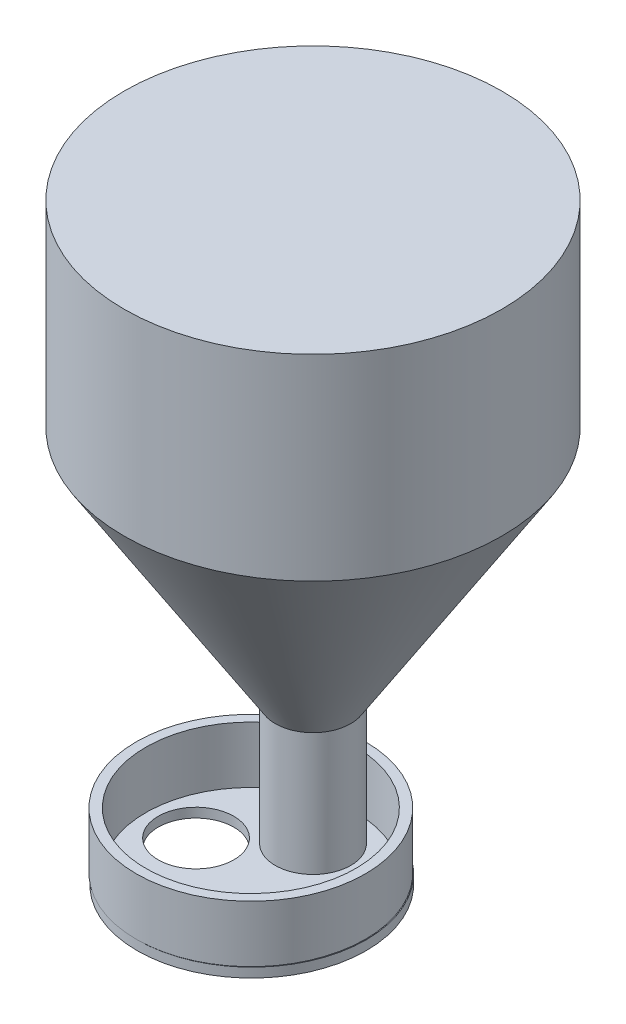
ISO-10303-21;
HEADER;
FILE_DESCRIPTION(('STEP AP214'),'2;1');
FILE_NAME('part.step','',(''),(''),'','','');
FILE_SCHEMA(('AUTOMOTIVE_DESIGN { 1 0 10303 214 1 1 1 1 }'));
ENDSEC;
DATA;
#1=APPLICATION_CONTEXT('core data for automotive mechanical design processes');
#2=APPLICATION_PROTOCOL_DEFINITION('international standard','automotive_design',2000,#1);
#3=PRODUCT_CONTEXT('',#1,'mechanical');
#4=PRODUCT('Part','Part','',(#3));
#5=PRODUCT_RELATED_PRODUCT_CATEGORY('part','',(#4));
#6=PRODUCT_DEFINITION_FORMATION('','',#4);
#7=PRODUCT_DEFINITION_CONTEXT('part definition',#1,'design');
#8=PRODUCT_DEFINITION('design','',#6,#7);
#9=PRODUCT_DEFINITION_SHAPE('','',#8);
#10=(LENGTH_UNIT() NAMED_UNIT(*) SI_UNIT(.MILLI.,.METRE.));
#11=(NAMED_UNIT(*) PLANE_ANGLE_UNIT() SI_UNIT($,.RADIAN.));
#12=(NAMED_UNIT(*) SI_UNIT($,.STERADIAN.) SOLID_ANGLE_UNIT());
#13=UNCERTAINTY_MEASURE_WITH_UNIT(LENGTH_MEASURE(1.E-05),#10,'distance_accuracy_value','');
#14=(GEOMETRIC_REPRESENTATION_CONTEXT(3) GLOBAL_UNCERTAINTY_ASSIGNED_CONTEXT((#13)) GLOBAL_UNIT_ASSIGNED_CONTEXT((#10,
#11,#12)) REPRESENTATION_CONTEXT('',''));
#15=CARTESIAN_POINT('',(0.,0.,0.));
#16=DIRECTION('',(0.,0.,1.));
#17=DIRECTION('',(1.,0.,0.));
#18=AXIS2_PLACEMENT_3D('',#15,#16,#17);
#19=CARTESIAN_POINT('',(-32.8934755645154,-325.,0.));
#20=DIRECTION('',(0.,-1.,0.));
#21=DIRECTION('',(0.,0.,-1.));
#22=AXIS2_PLACEMENT_3D('',#19,#20,#21);
#23=PLANE('',#22);
#24=CARTESIAN_POINT('',(-32.4436156280203,-325.,0.));
#25=DIRECTION('',(0.,-1.,0.));
#26=DIRECTION('',(0.,0.,-1.));
#27=AXIS2_PLACEMENT_3D('',#24,#25,#26);
#28=CIRCLE('',#27,60.6028261139354);
#29=CARTESIAN_POINT('',(-32.6685455962679,-325.,60.602408693923));
#30=VERTEX_POINT('',#29);
#31=CARTESIAN_POINT('',(-32.6685455962679,-325.,-60.602408693923));
#32=VERTEX_POINT('',#31);
#33=EDGE_CURVE('E60',#30,#32,#28,.T.);
#34=ORIENTED_EDGE('',*,*,#33,.F.);
#35=CARTESIAN_POINT('',(-32.8934755645154,-325.,0.));
#36=DIRECTION('',(0.,-1.,0.));
#37=DIRECTION('',(0.,0.,-1.));
#38=AXIS2_PLACEMENT_3D('',#35,#36,#37);
#39=CIRCLE('',#38,60.6028261139354);
#40=EDGE_CURVE('E54',#30,#32,#39,.T.);
#41=ORIENTED_EDGE('',*,*,#40,.T.);
#42=EDGE_LOOP('',(#34,#41));
#43=FACE_BOUND('',#42,.T.);
#44=ADVANCED_FACE('F45',(#43),#23,.T.);
#45=CARTESIAN_POINT('',(-32.8934755645154,-295.,0.));
#46=DIRECTION('',(0.,-1.,0.));
#47=DIRECTION('',(0.,0.,-1.));
#48=AXIS2_PLACEMENT_3D('',#45,#46,#47);
#49=PLANE('',#48);
#50=CARTESIAN_POINT('',(-32.8934755645154,-295.,0.));
#51=DIRECTION('',(0.,-1.,0.));
#52=DIRECTION('',(0.,0.,-1.));
#53=AXIS2_PLACEMENT_3D('',#50,#51,#52);
#54=CIRCLE('',#53,60.6028261139354);
#55=CARTESIAN_POINT('',(-32.8934755645154,-295.,-60.6028261139354));
#56=VERTEX_POINT('',#55);
#57=EDGE_CURVE('E49',#56,#56,#54,.T.);
#58=ORIENTED_EDGE('',*,*,#57,.F.);
#59=EDGE_LOOP('',(#58));
#60=FACE_BOUND('',#59,.T.);
#61=CARTESIAN_POINT('',(-32.8934755645154,-295.,0.));
#62=DIRECTION('',(0.,-1.,0.));
#63=DIRECTION('',(0.,0.,-1.));
#64=AXIS2_PLACEMENT_3D('',#61,#62,#63);
#65=CIRCLE('',#64,55.6028261139354);
#66=CARTESIAN_POINT('',(-32.8934755645154,-295.,-55.6028261139354));
#67=VERTEX_POINT('',#66);
#68=EDGE_CURVE('E82',#67,#67,#65,.T.);
#69=ORIENTED_EDGE('',*,*,#68,.T.);
#70=EDGE_LOOP('',(#69));
#71=FACE_BOUND('',#70,.T.);
#72=ADVANCED_FACE('F89',(#60,#71),#49,.F.);
#73=CARTESIAN_POINT('',(-32.8934755645154,-325.,0.));
#74=DIRECTION('',(0.,1.,0.));
#75=DIRECTION('',(0.,0.,1.));
#76=AXIS2_PLACEMENT_3D('',#73,#74,#75);
#77=CYLINDRICAL_SURFACE('',#76,60.6028261139354);
#78=EDGE_CURVE('E13',#32,#30,#39,.T.);
#79=ORIENTED_EDGE('',*,*,#78,.F.);
#80=ORIENTED_EDGE('',*,*,#40,.F.);
#81=EDGE_LOOP('',(#79,#80));
#82=FACE_BOUND('',#81,.T.);
#83=ORIENTED_EDGE('',*,*,#57,.T.);
#84=EDGE_LOOP('',(#83));
#85=FACE_BOUND('',#84,.T.);
#86=ADVANCED_FACE('F47',(#82,#85),#77,.T.);
#87=CARTESIAN_POINT('',(-32.8934755645154,-325.,0.));
#88=DIRECTION('',(0.,1.,0.));
#89=DIRECTION('',(0.,0.,1.));
#90=AXIS2_PLACEMENT_3D('',#87,#88,#89);
#91=CYLINDRICAL_SURFACE('',#90,55.6028261139354);
#92=CARTESIAN_POINT('',(-32.8934755645154,-325.,0.));
#93=DIRECTION('',(0.,-1.,0.));
#94=DIRECTION('',(0.,0.,-1.));
#95=AXIS2_PLACEMENT_3D('',#92,#93,#94);
#96=CIRCLE('',#95,55.6028261139354);
#97=CARTESIAN_POINT('',(-32.8934755645154,-325.,-55.6028261139354));
#98=VERTEX_POINT('',#97);
#99=EDGE_CURVE('E76',#98,#98,#96,.T.);
#100=ORIENTED_EDGE('',*,*,#99,.T.);
#101=EDGE_LOOP('',(#100));
#102=FACE_BOUND('',#101,.T.);
#103=ORIENTED_EDGE('',*,*,#68,.F.);
#104=EDGE_LOOP('',(#103));
#105=FACE_BOUND('',#104,.T.);
#106=ADVANCED_FACE('F95',(#102,#105),#91,.F.);
#107=CARTESIAN_POINT('',(-32.4436156280203,-325.,0.));
#108=DIRECTION('',(0.,-1.,0.));
#109=DIRECTION('',(0.,0.,-1.));
#110=AXIS2_PLACEMENT_3D('',#107,#108,#109);
#111=PLANE('',#110);
#112=EDGE_CURVE('E68',#32,#30,#28,.T.);
#113=ORIENTED_EDGE('',*,*,#112,.F.);
#114=ORIENTED_EDGE('',*,*,#78,.T.);
#115=EDGE_LOOP('',(#113,#114));
#116=FACE_BOUND('',#115,.T.);
#117=ADVANCED_FACE('F69',(#116),#111,.F.);
#118=CARTESIAN_POINT('',(-32.4436156280203,-330.,0.));
#119=DIRECTION('',(0.,-1.,0.));
#120=DIRECTION('',(0.,0.,-1.));
#121=AXIS2_PLACEMENT_3D('',#118,#119,#120);
#122=PLANE('',#121);
#123=CARTESIAN_POINT('',(-32.4436156280203,-330.,0.));
#124=DIRECTION('',(0.,-1.,0.));
#125=DIRECTION('',(0.,0.,-1.));
#126=AXIS2_PLACEMENT_3D('',#123,#124,#125);
#127=CIRCLE('',#126,60.6028261139354);
#128=CARTESIAN_POINT('',(-32.4436156280203,-330.,-60.6028261139354));
#129=VERTEX_POINT('',#128);
#130=EDGE_CURVE('E74',#129,#129,#127,.T.);
#131=ORIENTED_EDGE('',*,*,#130,.T.);
#132=EDGE_LOOP('',(#131));
#133=FACE_BOUND('',#132,.T.);
#134=CARTESIAN_POINT('',(-63.5377864199136,-330.,-1.61786030235778));
#135=DIRECTION('',(0.,-1.,0.));
#136=DIRECTION('',(0.,0.,-1.));
#137=AXIS2_PLACEMENT_3D('',#134,#135,#136);
#138=CIRCLE('',#137,20.);
#139=CARTESIAN_POINT('',(-63.5377864199136,-330.,-21.6178603023578));
#140=VERTEX_POINT('',#139);
#141=EDGE_CURVE('E71',#140,#140,#138,.T.);
#142=ORIENTED_EDGE('',*,*,#141,.F.);
#143=EDGE_LOOP('',(#142));
#144=FACE_BOUND('',#143,.T.);
#145=ADVANCED_FACE('F108',(#133,#144),#122,.T.);
#146=ORIENTED_EDGE('',*,*,#99,.F.);
#147=EDGE_LOOP('',(#146));
#148=FACE_BOUND('',#147,.T.);
#149=CARTESIAN_POINT('',(-63.5377864199136,-325.,-1.61786030235778));
#150=DIRECTION('',(0.,-1.,0.));
#151=DIRECTION('',(0.,0.,-1.));
#152=AXIS2_PLACEMENT_3D('',#149,#150,#151);
#153=CIRCLE('',#152,20.);
#154=CARTESIAN_POINT('',(-63.5377864199136,-325.,-21.6178603023578));
#155=VERTEX_POINT('',#154);
#156=EDGE_CURVE('E122',#155,#155,#153,.T.);
#157=ORIENTED_EDGE('',*,*,#156,.T.);
#158=EDGE_LOOP('',(#157));
#159=FACE_BOUND('',#158,.T.);
#160=ADVANCED_FACE('F104',(#148,#159),#111,.F.);
#161=CARTESIAN_POINT('',(-32.4436156280203,-330.,0.));
#162=DIRECTION('',(0.,1.,0.));
#163=DIRECTION('',(0.,0.,1.));
#164=AXIS2_PLACEMENT_3D('',#161,#162,#163);
#165=CYLINDRICAL_SURFACE('',#164,60.6028261139354);
#166=ORIENTED_EDGE('',*,*,#130,.F.);
#167=EDGE_LOOP('',(#166));
#168=FACE_BOUND('',#167,.T.);
#169=ORIENTED_EDGE('',*,*,#33,.T.);
#170=ORIENTED_EDGE('',*,*,#112,.T.);
#171=EDGE_LOOP('',(#169,#170));
#172=FACE_BOUND('',#171,.T.);
#173=ADVANCED_FACE('F73',(#168,#172),#165,.T.);
#174=CARTESIAN_POINT('',(-63.5377864199136,-330.,-1.61786030235778));
#175=DIRECTION('',(0.,1.,0.));
#176=DIRECTION('',(0.,0.,1.));
#177=AXIS2_PLACEMENT_3D('',#174,#175,#176);
#178=CYLINDRICAL_SURFACE('',#177,20.);
#179=ORIENTED_EDGE('',*,*,#141,.T.);
#180=EDGE_LOOP('',(#179));
#181=FACE_BOUND('',#180,.T.);
#182=ORIENTED_EDGE('',*,*,#156,.F.);
#183=EDGE_LOOP('',(#182));
#184=FACE_BOUND('',#183,.T.);
#185=ADVANCED_FACE('F103',(#181,#184),#178,.F.);
#186=CLOSED_SHELL('',(#44,#72,#86,#106,#117,#145,#160,#173,#185));
#187=MANIFOLD_SOLID_BREP('B2',#186);
#188=CARTESIAN_POINT('',(0.,-104.,0.));
#189=DIRECTION('',(0.,1.,0.));
#190=DIRECTION('',(0.,0.,1.));
#191=AXIS2_PLACEMENT_3D('',#188,#189,#190);
#192=CYLINDRICAL_SURFACE('',#191,100.);
#193=CARTESIAN_POINT('',(0.,-104.,0.));
#194=DIRECTION('',(0.,-1.,0.));
#195=DIRECTION('',(0.,0.,-1.));
#196=AXIS2_PLACEMENT_3D('',#193,#194,#195);
#197=CIRCLE('',#196,100.);
#198=CARTESIAN_POINT('',(0.,-104.,100.));
#199=VERTEX_POINT('',#198);
#200=EDGE_CURVE('E192',#199,#199,#197,.T.);
#201=CARTESIAN_POINT('',(0.,0.,0.));
#202=DIRECTION('',(0.,1.,0.));
#203=DIRECTION('',(0.,0.,1.));
#204=AXIS2_PLACEMENT_3D('',#201,#202,#203);
#205=CIRCLE('',#204,100.);
#206=CARTESIAN_POINT('',(0.,0.,100.));
#207=VERTEX_POINT('',#206);
#208=EDGE_CURVE('E44',#207,#207,#205,.T.);
#209=CARTESIAN_POINT('',(0.,-104.,100.));
#210=CARTESIAN_POINT('',(0.,-102.916666666667,100.));
#211=CARTESIAN_POINT('',(0.,-101.833333333333,100.));
#212=CARTESIAN_POINT('',(0.,-99.6666666666667,100.));
#213=CARTESIAN_POINT('',(0.,-98.5833333333333,100.));
#214=CARTESIAN_POINT('',(0.,-96.4166666666667,100.));
#215=CARTESIAN_POINT('',(0.,-95.3333333333333,100.));
#216=CARTESIAN_POINT('',(0.,-93.1666666666666,100.));
#217=CARTESIAN_POINT('',(0.,-92.0833333333333,100.));
#218=CARTESIAN_POINT('',(0.,-89.9166666666667,100.));
#219=CARTESIAN_POINT('',(0.,-88.8333333333333,100.));
#220=CARTESIAN_POINT('',(0.,-86.6666666666667,100.));
#221=CARTESIAN_POINT('',(0.,-85.5833333333333,100.));
#222=CARTESIAN_POINT('',(0.,-83.4166666666667,100.));
#223=CARTESIAN_POINT('',(0.,-82.3333333333333,100.));
#224=CARTESIAN_POINT('',(0.,-80.1666666666666,100.));
#225=CARTESIAN_POINT('',(0.,-79.0833333333333,100.));
#226=CARTESIAN_POINT('',(0.,-76.9166666666666,100.));
#227=CARTESIAN_POINT('',(0.,-75.8333333333333,100.));
#228=CARTESIAN_POINT('',(0.,-73.6666666666667,100.));
#229=CARTESIAN_POINT('',(0.,-72.5833333333333,100.));
#230=CARTESIAN_POINT('',(0.,-70.4166666666667,100.));
#231=CARTESIAN_POINT('',(0.,-69.3333333333333,100.));
#232=CARTESIAN_POINT('',(0.,-67.1666666666667,100.));
#233=CARTESIAN_POINT('',(0.,-66.0833333333333,100.));
#234=CARTESIAN_POINT('',(0.,-63.9166666666667,100.));
#235=CARTESIAN_POINT('',(0.,-62.8333333333333,100.));
#236=CARTESIAN_POINT('',(0.,-60.6666666666667,100.));
#237=CARTESIAN_POINT('',(0.,-59.5833333333333,100.));
#238=CARTESIAN_POINT('',(0.,-57.4166666666667,100.));
#239=CARTESIAN_POINT('',(0.,-56.3333333333333,100.));
#240=CARTESIAN_POINT('',(0.,-54.1666666666667,100.));
#241=CARTESIAN_POINT('',(0.,-53.0833333333333,100.));
#242=CARTESIAN_POINT('',(0.,-50.9166666666667,100.));
#243=CARTESIAN_POINT('',(0.,-49.8333333333333,100.));
#244=CARTESIAN_POINT('',(0.,-47.6666666666667,100.));
#245=CARTESIAN_POINT('',(0.,-46.5833333333333,100.));
#246=CARTESIAN_POINT('',(0.,-44.4166666666667,100.));
#247=CARTESIAN_POINT('',(0.,-43.3333333333333,100.));
#248=CARTESIAN_POINT('',(0.,-41.1666666666667,100.));
#249=CARTESIAN_POINT('',(0.,-40.0833333333333,100.));
#250=CARTESIAN_POINT('',(0.,-37.9166666666667,100.));
#251=CARTESIAN_POINT('',(0.,-36.8333333333333,100.));
#252=CARTESIAN_POINT('',(0.,-34.6666666666667,100.));
#253=CARTESIAN_POINT('',(0.,-33.5833333333333,100.));
#254=CARTESIAN_POINT('',(0.,-31.4166666666667,100.));
#255=CARTESIAN_POINT('',(0.,-30.3333333333333,100.));
#256=CARTESIAN_POINT('',(0.,-28.1666666666667,100.));
#257=CARTESIAN_POINT('',(0.,-27.0833333333333,100.));
#258=CARTESIAN_POINT('',(0.,-24.9166666666667,100.));
#259=CARTESIAN_POINT('',(0.,-23.8333333333333,100.));
#260=CARTESIAN_POINT('',(0.,-21.6666666666667,100.));
#261=CARTESIAN_POINT('',(0.,-20.5833333333333,100.));
#262=CARTESIAN_POINT('',(0.,-18.4166666666667,100.));
#263=CARTESIAN_POINT('',(0.,-17.3333333333333,100.));
#264=CARTESIAN_POINT('',(0.,-15.1666666666667,100.));
#265=CARTESIAN_POINT('',(0.,-14.0833333333333,100.));
#266=CARTESIAN_POINT('',(0.,-11.9166666666667,100.));
#267=CARTESIAN_POINT('',(0.,-10.8333333333333,100.));
#268=CARTESIAN_POINT('',(0.,-8.66666666666666,100.));
#269=CARTESIAN_POINT('',(0.,-7.58333333333333,100.));
#270=CARTESIAN_POINT('',(0.,-5.41666666666667,100.));
#271=CARTESIAN_POINT('',(0.,-4.33333333333334,100.));
#272=CARTESIAN_POINT('',(0.,-2.16666666666667,100.));
#273=CARTESIAN_POINT('',(0.,-1.08333333333333,100.));
#274=CARTESIAN_POINT('',(0.,0.,100.));
#275=B_SPLINE_CURVE_WITH_KNOTS('',3,(#209,#210,#211,#212,#213,#214,#215,#216,#217,#218,#219,
#220,#221,#222,#223,#224,#225,#226,#227,#228,#229,#230,#231,#232,#233,#234,#235,#236,#237,#238,
#239,#240,#241,#242,#243,#244,#245,#246,#247,#248,#249,#250,#251,#252,#253,#254,#255,#256,#257,
#258,#259,#260,#261,#262,#263,#264,#265,#266,#267,#268,#269,#270,#271,#272,#273,#274),
.UNSPECIFIED.,.F.,.F.,(4,2,2,2,2,2,2,2,2,2,2,2,2,2,2,2,2,2,2,2,2,2,2,2,2,2,2,2,2,2,2,2,4),(0.,
3.25,6.50000000000001,9.75000000000001,13.,16.25,19.5,22.75,26.,29.25,32.5,35.75,39.,42.25,45.5,
48.75,52.,55.25,58.5,61.75,65.,68.25,71.5,74.75,78.,81.25,84.5,87.75,91.,94.25,97.5,100.75,
104.),.UNSPECIFIED.);
#276=EDGE_CURVE('BSEAM183',#199,#207,#275,.T.);
#277=ORIENTED_EDGE('',*,*,#200,.F.);
#278=ORIENTED_EDGE('',*,*,#208,.F.);
#279=ORIENTED_EDGE('',*,*,#276,.T.);
#280=ORIENTED_EDGE('',*,*,#276,.F.);
#281=EDGE_LOOP('',(#277,#279,#278,#280));
#282=FACE_BOUND('',#281,.T.);
#283=ADVANCED_FACE('F183',(#282),#192,.T.);
#284=CARTESIAN_POINT('',(0.,0.,0.));
#285=DIRECTION('',(0.,1.,0.));
#286=DIRECTION('',(0.,0.,1.));
#287=AXIS2_PLACEMENT_3D('',#284,#285,#286);
#288=PLANE('',#287);
#289=ORIENTED_EDGE('',*,*,#208,.T.);
#290=EDGE_LOOP('',(#289));
#291=FACE_BOUND('',#290,.T.);
#292=ADVANCED_FACE('F228',(#291),#288,.T.);
#293=CARTESIAN_POINT('',(0.,-230.,0.));
#294=DIRECTION('',(0.,1.,0.));
#295=DIRECTION('',(0.,0.,1.));
#296=AXIS2_PLACEMENT_3D('',#293,#294,#295);
#297=CONICAL_SURFACE('',#296,20.,0.565701468656178);
#298=CARTESIAN_POINT('',(0.,-230.,0.));
#299=DIRECTION('',(0.,-1.,0.));
#300=DIRECTION('',(0.,0.,-1.));
#301=AXIS2_PLACEMENT_3D('',#298,#299,#300);
#302=CIRCLE('',#301,20.);
#303=CARTESIAN_POINT('',(0.,-230.,-20.));
#304=VERTEX_POINT('',#303);
#305=EDGE_CURVE('E203',#304,#304,#302,.T.);
#306=ORIENTED_EDGE('',*,*,#305,.F.);
#307=EDGE_LOOP('',(#306));
#308=FACE_BOUND('',#307,.T.);
#309=ORIENTED_EDGE('',*,*,#200,.T.);
#310=EDGE_LOOP('',(#309));
#311=FACE_BOUND('',#310,.T.);
#312=ADVANCED_FACE('F220',(#308,#311),#297,.T.);
#313=CARTESIAN_POINT('',(0.,-295.,0.));
#314=DIRECTION('',(0.,1.,0.));
#315=DIRECTION('',(0.,0.,1.));
#316=AXIS2_PLACEMENT_3D('',#313,#314,#315);
#317=CYLINDRICAL_SURFACE('',#316,20.);
#318=CARTESIAN_POINT('',(0.,-295.,0.));
#319=DIRECTION('',(0.,-1.,0.));
#320=DIRECTION('',(0.,0.,-1.));
#321=AXIS2_PLACEMENT_3D('',#318,#319,#320);
#322=CIRCLE('',#321,20.);
#323=CARTESIAN_POINT('',(0.,-295.,-20.));
#324=VERTEX_POINT('',#323);
#325=EDGE_CURVE('E197',#324,#324,#322,.T.);
#326=ORIENTED_EDGE('',*,*,#325,.F.);
#327=EDGE_LOOP('',(#326));
#328=FACE_BOUND('',#327,.T.);
#329=ORIENTED_EDGE('',*,*,#305,.T.);
#330=EDGE_LOOP('',(#329));
#331=FACE_BOUND('',#330,.T.);
#332=ADVANCED_FACE('F204',(#328,#331),#317,.T.);
#333=CARTESIAN_POINT('',(0.,-295.,0.));
#334=DIRECTION('',(0.,-1.,0.));
#335=DIRECTION('',(0.,0.,-1.));
#336=AXIS2_PLACEMENT_3D('',#333,#334,#335);
#337=PLANE('',#336);
#338=CARTESIAN_POINT('',(0.,-295.,0.));
#339=DIRECTION('',(0.,-1.,0.));
#340=DIRECTION('',(0.,0.,-1.));
#341=AXIS2_PLACEMENT_3D('',#338,#339,#340);
#342=CIRCLE('',#341,17.5);
#343=CARTESIAN_POINT('',(0.,-295.,-17.5));
#344=VERTEX_POINT('',#343);
#345=EDGE_CURVE('E211',#344,#344,#342,.T.);
#346=ORIENTED_EDGE('',*,*,#345,.F.);
#347=EDGE_LOOP('',(#346));
#348=FACE_BOUND('',#347,.T.);
#349=ORIENTED_EDGE('',*,*,#325,.T.);
#350=EDGE_LOOP('',(#349));
#351=FACE_BOUND('',#350,.T.);
#352=ADVANCED_FACE('F258',(#348,#351),#337,.T.);
#353=CARTESIAN_POINT('',(0.,-271.,0.));
#354=DIRECTION('',(0.,-1.,0.));
#355=DIRECTION('',(0.,0.,-1.));
#356=AXIS2_PLACEMENT_3D('',#353,#354,#355);
#357=CYLINDRICAL_SURFACE('',#356,17.5);
#358=CARTESIAN_POINT('',(0.,-271.,0.));
#359=DIRECTION('',(0.,-1.,0.));
#360=DIRECTION('',(0.,0.,-1.));
#361=AXIS2_PLACEMENT_3D('',#358,#359,#360);
#362=CIRCLE('',#361,17.5);
#363=CARTESIAN_POINT('',(0.,-271.,-17.5));
#364=VERTEX_POINT('',#363);
#365=EDGE_CURVE('E207',#364,#364,#362,.T.);
#366=ORIENTED_EDGE('',*,*,#365,.F.);
#367=EDGE_LOOP('',(#366));
#368=FACE_BOUND('',#367,.T.);
#369=ORIENTED_EDGE('',*,*,#345,.T.);
#370=EDGE_LOOP('',(#369));
#371=FACE_BOUND('',#370,.T.);
#372=ADVANCED_FACE('F267',(#368,#371),#357,.F.);
#373=CARTESIAN_POINT('',(0.,-271.,0.));
#374=DIRECTION('',(0.,-1.,0.));
#375=DIRECTION('',(0.,0.,-1.));
#376=AXIS2_PLACEMENT_3D('',#373,#374,#375);
#377=PLANE('',#376);
#378=ORIENTED_EDGE('',*,*,#365,.T.);
#379=EDGE_LOOP('',(#378));
#380=FACE_BOUND('',#379,.T.);
#381=ADVANCED_FACE('F276',(#380),#377,.T.);
#382=CLOSED_SHELL('',(#283,#292,#312,#332,#352,#372,#381));
#383=MANIFOLD_SOLID_BREP('B7',#382);
#384=ADVANCED_BREP_SHAPE_REPRESENTATION('',(#18,#187,#383),#14);
#385=SHAPE_DEFINITION_REPRESENTATION(#9,#384);
ENDSEC;
END-ISO-10303-21;
